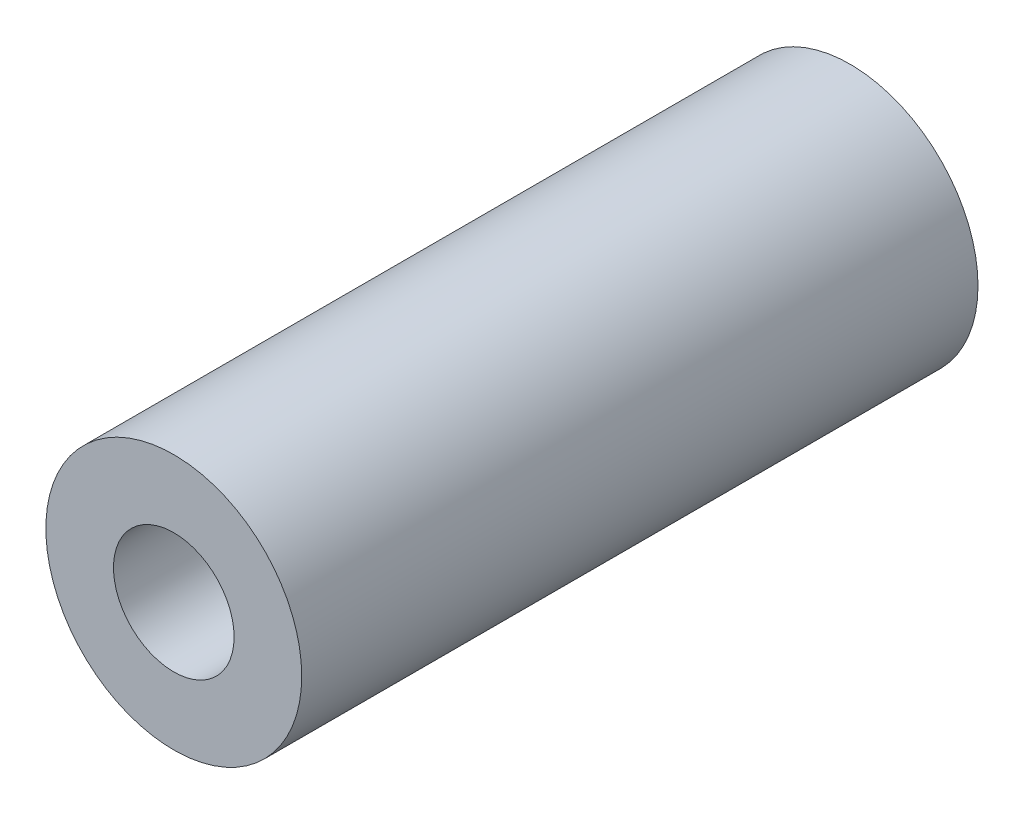
ISO-10303-21;
HEADER;
FILE_DESCRIPTION(('STEP AP214'),'2;1');
FILE_NAME('part.step','',(''),(''),'','','');
FILE_SCHEMA(('AUTOMOTIVE_DESIGN { 1 0 10303 214 1 1 1 1 }'));
ENDSEC;
DATA;
#1=APPLICATION_CONTEXT('core data for automotive mechanical design processes');
#2=APPLICATION_PROTOCOL_DEFINITION('international standard','automotive_design',2000,#1);
#3=PRODUCT_CONTEXT('',#1,'mechanical');
#4=PRODUCT('Part','Part','',(#3));
#5=PRODUCT_RELATED_PRODUCT_CATEGORY('part','',(#4));
#6=PRODUCT_DEFINITION_FORMATION('','',#4);
#7=PRODUCT_DEFINITION_CONTEXT('part definition',#1,'design');
#8=PRODUCT_DEFINITION('design','',#6,#7);
#9=PRODUCT_DEFINITION_SHAPE('','',#8);
#10=(LENGTH_UNIT() NAMED_UNIT(*) SI_UNIT(.MILLI.,.METRE.));
#11=(NAMED_UNIT(*) PLANE_ANGLE_UNIT() SI_UNIT($,.RADIAN.));
#12=(NAMED_UNIT(*) SI_UNIT($,.STERADIAN.) SOLID_ANGLE_UNIT());
#13=UNCERTAINTY_MEASURE_WITH_UNIT(LENGTH_MEASURE(1.E-05),#10,'distance_accuracy_value','');
#14=(GEOMETRIC_REPRESENTATION_CONTEXT(3) GLOBAL_UNCERTAINTY_ASSIGNED_CONTEXT((#13)) GLOBAL_UNIT_ASSIGNED_CONTEXT((#10,
#11,#12)) REPRESENTATION_CONTEXT('',''));
#15=CARTESIAN_POINT('',(0.,0.,0.));
#16=DIRECTION('',(0.,0.,1.));
#17=DIRECTION('',(1.,0.,0.));
#18=AXIS2_PLACEMENT_3D('',#15,#16,#17);
#19=CARTESIAN_POINT('',(-44.02985074626,-13.1343283582,-27.75));
#20=DIRECTION('',(0.,0.,1.));
#21=DIRECTION('',(1.,0.,0.));
#22=AXIS2_PLACEMENT_3D('',#19,#20,#21);
#23=CYLINDRICAL_SURFACE('',#22,1.65);
#24=DIRECTION('',(0.,0.,1.));
#25=VECTOR('',#24,1.);
#26=CARTESIAN_POINT('',(-42.37985074626,-13.1343283582,-27.75));
#27=LINE('',#26,#25);
#28=CARTESIAN_POINT('',(-42.37985074626,-13.1343283582,0.));
#29=VERTEX_POINT('',#28);
#30=CARTESIAN_POINT('',(-42.37985074626,-13.1343283582,18.5));
#31=VERTEX_POINT('',#30);
#32=EDGE_CURVE('E10',#29,#31,#27,.T.);
#33=ORIENTED_EDGE('',*,*,#32,.F.);
#34=CARTESIAN_POINT('',(-44.02985074626,-13.1343283582,0.));
#35=DIRECTION('',(0.,0.,1.));
#36=DIRECTION('',(1.,0.,0.));
#37=AXIS2_PLACEMENT_3D('',#34,#35,#36);
#38=CIRCLE('',#37,1.65);
#39=EDGE_CURVE('E27',#29,#29,#38,.T.);
#40=ORIENTED_EDGE('',*,*,#39,.F.);
#41=ORIENTED_EDGE('',*,*,#32,.T.);
#42=CARTESIAN_POINT('',(-44.02985074626,-13.1343283582,18.5));
#43=DIRECTION('',(0.,0.,1.));
#44=DIRECTION('',(1.,0.,0.));
#45=AXIS2_PLACEMENT_3D('',#42,#43,#44);
#46=CIRCLE('',#45,1.65);
#47=EDGE_CURVE('E65',#31,#31,#46,.T.);
#48=ORIENTED_EDGE('',*,*,#47,.T.);
#49=EDGE_LOOP('',(#33,#40,#41,#48));
#50=FACE_BOUND('',#49,.T.);
#51=ADVANCED_FACE('F16',(#50),#23,.F.);
#52=CARTESIAN_POINT('',(-44.02985074626,-13.1343283582,0.));
#53=DIRECTION('',(0.,0.,1.));
#54=DIRECTION('',(1.,0.,0.));
#55=AXIS2_PLACEMENT_3D('',#52,#53,#54);
#56=PLANE('',#55);
#57=ORIENTED_EDGE('',*,*,#39,.T.);
#58=EDGE_LOOP('',(#57));
#59=FACE_BOUND('',#58,.T.);
#60=CARTESIAN_POINT('',(-44.02985074626,-13.1343283582,0.));
#61=DIRECTION('',(0.,0.,1.));
#62=DIRECTION('',(1.,0.,0.));
#63=AXIS2_PLACEMENT_3D('',#60,#61,#62);
#64=CIRCLE('',#63,3.5);
#65=CARTESIAN_POINT('',(-40.52985074626,-13.1343283582,0.));
#66=VERTEX_POINT('',#65);
#67=EDGE_CURVE('E50',#66,#66,#64,.T.);
#68=ORIENTED_EDGE('',*,*,#67,.F.);
#69=EDGE_LOOP('',(#68));
#70=FACE_BOUND('',#69,.T.);
#71=ADVANCED_FACE('F72',(#59,#70),#56,.F.);
#72=CARTESIAN_POINT('',(-44.02985074626,-13.1343283582,18.5));
#73=DIRECTION('',(0.,0.,1.));
#74=DIRECTION('',(1.,0.,0.));
#75=AXIS2_PLACEMENT_3D('',#72,#73,#74);
#76=PLANE('',#75);
#77=ORIENTED_EDGE('',*,*,#47,.F.);
#78=EDGE_LOOP('',(#77));
#79=FACE_BOUND('',#78,.T.);
#80=CARTESIAN_POINT('',(-44.02985074626,-13.1343283582,18.5));
#81=DIRECTION('',(0.,0.,1.));
#82=DIRECTION('',(1.,0.,0.));
#83=AXIS2_PLACEMENT_3D('',#80,#81,#82);
#84=CIRCLE('',#83,3.5);
#85=CARTESIAN_POINT('',(-40.52985074626,-13.1343283582,18.5));
#86=VERTEX_POINT('',#85);
#87=EDGE_CURVE('E56',#86,#86,#84,.T.);
#88=ORIENTED_EDGE('',*,*,#87,.T.);
#89=EDGE_LOOP('',(#88));
#90=FACE_BOUND('',#89,.T.);
#91=ADVANCED_FACE('F18',(#79,#90),#76,.T.);
#92=CARTESIAN_POINT('',(-44.02985074626,-13.1343283582,0.));
#93=DIRECTION('',(0.,0.,1.));
#94=DIRECTION('',(1.,0.,0.));
#95=AXIS2_PLACEMENT_3D('',#92,#93,#94);
#96=CYLINDRICAL_SURFACE('',#95,3.5);
#97=ORIENTED_EDGE('',*,*,#87,.F.);
#98=DIRECTION('',(0.,0.,1.));
#99=VECTOR('',#98,1.);
#100=CARTESIAN_POINT('',(-40.52985074626,-13.1343283582,0.));
#101=LINE('',#100,#99);
#102=EDGE_CURVE('E20',#66,#86,#101,.T.);
#103=ORIENTED_EDGE('',*,*,#102,.F.);
#104=ORIENTED_EDGE('',*,*,#67,.T.);
#105=ORIENTED_EDGE('',*,*,#102,.T.);
#106=EDGE_LOOP('',(#97,#103,#104,#105));
#107=FACE_BOUND('',#106,.T.);
#108=ADVANCED_FACE('F55',(#107),#96,.T.);
#109=CLOSED_SHELL('',(#51,#71,#91,#108));
#110=MANIFOLD_SOLID_BREP('B1',#109);
#111=ADVANCED_BREP_SHAPE_REPRESENTATION('',(#18,#110),#14);
#112=SHAPE_DEFINITION_REPRESENTATION(#9,#111);
ENDSEC;
END-ISO-10303-21;
